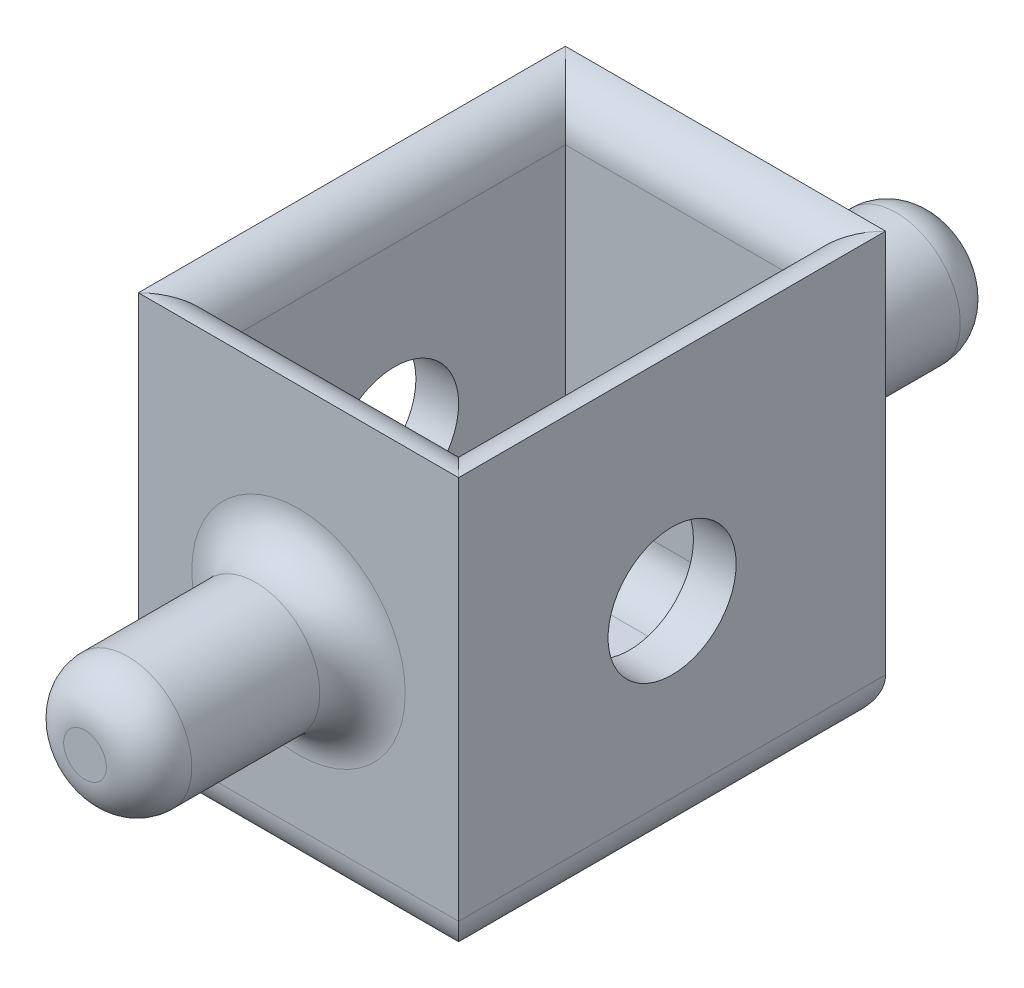
ISO-10303-21;
HEADER;
FILE_DESCRIPTION(('STEP AP214'),'2;1');
FILE_NAME('part.step','',(''),(''),'','','');
FILE_SCHEMA(('AUTOMOTIVE_DESIGN { 1 0 10303 214 1 1 1 1 }'));
ENDSEC;
DATA;
#1=APPLICATION_CONTEXT('core data for automotive mechanical design processes');
#2=APPLICATION_PROTOCOL_DEFINITION('international standard','automotive_design',2000,#1);
#3=PRODUCT_CONTEXT('',#1,'mechanical');
#4=PRODUCT('Part','Part','',(#3));
#5=PRODUCT_RELATED_PRODUCT_CATEGORY('part','',(#4));
#6=PRODUCT_DEFINITION_FORMATION('','',#4);
#7=PRODUCT_DEFINITION_CONTEXT('part definition',#1,'design');
#8=PRODUCT_DEFINITION('design','',#6,#7);
#9=PRODUCT_DEFINITION_SHAPE('','',#8);
#10=(LENGTH_UNIT() NAMED_UNIT(*) SI_UNIT(.MILLI.,.METRE.));
#11=(NAMED_UNIT(*) PLANE_ANGLE_UNIT() SI_UNIT($,.RADIAN.));
#12=(NAMED_UNIT(*) SI_UNIT($,.STERADIAN.) SOLID_ANGLE_UNIT());
#13=UNCERTAINTY_MEASURE_WITH_UNIT(LENGTH_MEASURE(1.E-05),#10,'distance_accuracy_value','');
#14=(GEOMETRIC_REPRESENTATION_CONTEXT(3) GLOBAL_UNCERTAINTY_ASSIGNED_CONTEXT((#13)) GLOBAL_UNIT_ASSIGNED_CONTEXT((#10,
#11,#12)) REPRESENTATION_CONTEXT('',''));
#15=CARTESIAN_POINT('',(0.,0.,0.));
#16=DIRECTION('',(0.,0.,1.));
#17=DIRECTION('',(1.,0.,0.));
#18=AXIS2_PLACEMENT_3D('',#15,#16,#17);
#19=CARTESIAN_POINT('',(0.,0.,0.));
#20=DIRECTION('',(0.,0.,-1.));
#21=DIRECTION('',(-1.,0.,0.));
#22=AXIS2_PLACEMENT_3D('',#19,#20,#21);
#23=PLANE('',#22);
#24=CARTESIAN_POINT('',(0.,0.,0.));
#25=DIRECTION('',(0.,0.,-1.));
#26=DIRECTION('',(-1.,0.,0.));
#27=AXIS2_PLACEMENT_3D('',#24,#25,#26);
#28=CIRCLE('',#27,6.35);
#29=CARTESIAN_POINT('',(-6.35,0.,0.));
#30=VERTEX_POINT('',#29);
#31=EDGE_CURVE('E198',#30,#30,#28,.F.);
#32=ORIENTED_EDGE('',*,*,#31,.T.);
#33=EDGE_LOOP('',(#32));
#34=FACE_BOUND('',#33,.T.);
#35=DIRECTION('',(0.,1.,0.));
#36=VECTOR('',#35,1.);
#37=CARTESIAN_POINT('',(9.525,-12.7,0.));
#38=LINE('',#37,#36);
#39=CARTESIAN_POINT('',(9.525,-10.16,0.));
#40=VERTEX_POINT('',#39);
#41=CARTESIAN_POINT('',(9.525,12.7,0.));
#42=VERTEX_POINT('',#41);
#43=EDGE_CURVE('E142',#40,#42,#38,.T.);
#44=ORIENTED_EDGE('',*,*,#43,.F.);
#45=DIRECTION('',(1.,0.,0.));
#46=VECTOR('',#45,1.);
#47=CARTESIAN_POINT('',(-9.525,-10.16,0.));
#48=LINE('',#47,#46);
#49=CARTESIAN_POINT('',(-9.525,-10.16,0.));
#50=VERTEX_POINT('',#49);
#51=EDGE_CURVE('E201',#40,#50,#48,.F.);
#52=ORIENTED_EDGE('',*,*,#51,.T.);
#53=DIRECTION('',(0.,-1.,0.));
#54=VECTOR('',#53,1.);
#55=CARTESIAN_POINT('',(-9.525,-12.7,0.));
#56=LINE('',#55,#54);
#57=CARTESIAN_POINT('',(-9.525,12.7,0.));
#58=VERTEX_POINT('',#57);
#59=EDGE_CURVE('E135',#58,#50,#56,.T.);
#60=ORIENTED_EDGE('',*,*,#59,.F.);
#61=DIRECTION('',(-1.,0.,0.));
#62=VECTOR('',#61,1.);
#63=CARTESIAN_POINT('',(-9.525,12.7,0.));
#64=LINE('',#63,#62);
#65=EDGE_CURVE('E168',#42,#58,#64,.T.);
#66=ORIENTED_EDGE('',*,*,#65,.F.);
#67=EDGE_LOOP('',(#44,#52,#60,#66));
#68=FACE_BOUND('',#67,.T.);
#69=ADVANCED_FACE('F32',(#34,#68),#23,.T.);
#70=CARTESIAN_POINT('',(0.,0.,25.4));
#71=DIRECTION('',(0.,0.,-1.));
#72=DIRECTION('',(-1.,0.,0.));
#73=AXIS2_PLACEMENT_3D('',#70,#71,#72);
#74=PLANE('',#73);
#75=CARTESIAN_POINT('',(0.,0.,25.4));
#76=DIRECTION('',(0.,0.,-1.));
#77=DIRECTION('',(-1.,0.,0.));
#78=AXIS2_PLACEMENT_3D('',#75,#76,#77);
#79=CIRCLE('',#78,6.35);
#80=CARTESIAN_POINT('',(-6.35000000000001,0.,25.4));
#81=VERTEX_POINT('',#80);
#82=EDGE_CURVE('E192',#81,#81,#79,.T.);
#83=ORIENTED_EDGE('',*,*,#82,.T.);
#84=EDGE_LOOP('',(#83));
#85=FACE_BOUND('',#84,.T.);
#86=DIRECTION('',(0.,-1.,0.));
#87=VECTOR('',#86,1.);
#88=CARTESIAN_POINT('',(-9.525,-12.7,25.4));
#89=LINE('',#88,#87);
#90=CARTESIAN_POINT('',(-9.525,12.7,25.4));
#91=VERTEX_POINT('',#90);
#92=CARTESIAN_POINT('',(-9.525,-10.16,25.4));
#93=VERTEX_POINT('',#92);
#94=EDGE_CURVE('E162',#91,#93,#89,.T.);
#95=ORIENTED_EDGE('',*,*,#94,.T.);
#96=DIRECTION('',(1.,0.,0.));
#97=VECTOR('',#96,1.);
#98=CARTESIAN_POINT('',(0.,-10.16,25.4));
#99=LINE('',#98,#97);
#100=CARTESIAN_POINT('',(9.525,-10.16,25.4));
#101=VERTEX_POINT('',#100);
#102=EDGE_CURVE('E132',#93,#101,#99,.T.);
#103=ORIENTED_EDGE('',*,*,#102,.T.);
#104=DIRECTION('',(0.,1.,0.));
#105=VECTOR('',#104,1.);
#106=CARTESIAN_POINT('',(9.525,-12.7,25.4));
#107=LINE('',#106,#105);
#108=CARTESIAN_POINT('',(9.525,12.7,25.4));
#109=VERTEX_POINT('',#108);
#110=EDGE_CURVE('E124',#101,#109,#107,.T.);
#111=ORIENTED_EDGE('',*,*,#110,.T.);
#112=DIRECTION('',(-1.,0.,0.));
#113=VECTOR('',#112,1.);
#114=CARTESIAN_POINT('',(-9.525,12.7,25.4));
#115=LINE('',#114,#113);
#116=EDGE_CURVE('E129',#109,#91,#115,.T.);
#117=ORIENTED_EDGE('',*,*,#116,.T.);
#118=EDGE_LOOP('',(#95,#103,#111,#117));
#119=FACE_BOUND('',#118,.T.);
#120=ADVANCED_FACE('F127',(#85,#119),#74,.F.);
#121=CARTESIAN_POINT('',(9.525,-12.7,25.4));
#122=DIRECTION('',(-1.,0.,0.));
#123=DIRECTION('',(0.,0.,1.));
#124=AXIS2_PLACEMENT_3D('',#121,#122,#123);
#125=PLANE('',#124);
#126=CARTESIAN_POINT('',(9.525,0.,12.7));
#127=DIRECTION('',(1.,0.,0.));
#128=DIRECTION('',(0.,0.,-1.));
#129=AXIS2_PLACEMENT_3D('',#126,#127,#128);
#130=CIRCLE('',#129,3.81);
#131=CARTESIAN_POINT('',(9.525,0.,8.89));
#132=VERTEX_POINT('',#131);
#133=EDGE_CURVE('E252',#132,#132,#130,.T.);
#134=ORIENTED_EDGE('',*,*,#133,.F.);
#135=EDGE_LOOP('',(#134));
#136=FACE_BOUND('',#135,.T.);
#137=ORIENTED_EDGE('',*,*,#110,.F.);
#138=DIRECTION('',(0.,0.,-1.));
#139=VECTOR('',#138,1.);
#140=CARTESIAN_POINT('',(9.525,-10.16,25.4));
#141=LINE('',#140,#139);
#142=EDGE_CURVE('E196',#101,#40,#141,.T.);
#143=ORIENTED_EDGE('',*,*,#142,.T.);
#144=ORIENTED_EDGE('',*,*,#43,.T.);
#145=DIRECTION('',(0.,0.,-1.));
#146=VECTOR('',#145,1.);
#147=CARTESIAN_POINT('',(9.525,12.7,25.4));
#148=LINE('',#147,#146);
#149=EDGE_CURVE('E138',#109,#42,#148,.T.);
#150=ORIENTED_EDGE('',*,*,#149,.F.);
#151=EDGE_LOOP('',(#137,#143,#144,#150));
#152=FACE_BOUND('',#151,.T.);
#153=ADVANCED_FACE('F140',(#136,#152),#125,.F.);
#154=CARTESIAN_POINT('',(-9.525,-12.7,25.4));
#155=DIRECTION('',(1.,0.,0.));
#156=DIRECTION('',(0.,0.,-1.));
#157=AXIS2_PLACEMENT_3D('',#154,#155,#156);
#158=PLANE('',#157);
#159=CARTESIAN_POINT('',(-9.525,0.,12.7));
#160=DIRECTION('',(1.,0.,0.));
#161=DIRECTION('',(0.,0.,-1.));
#162=AXIS2_PLACEMENT_3D('',#159,#160,#161);
#163=CIRCLE('',#162,3.81);
#164=CARTESIAN_POINT('',(-9.525,0.,8.89));
#165=VERTEX_POINT('',#164);
#166=EDGE_CURVE('E180',#165,#165,#163,.T.);
#167=ORIENTED_EDGE('',*,*,#166,.T.);
#168=EDGE_LOOP('',(#167));
#169=FACE_BOUND('',#168,.T.);
#170=ORIENTED_EDGE('',*,*,#59,.T.);
#171=DIRECTION('',(0.,0.,-1.));
#172=VECTOR('',#171,1.);
#173=CARTESIAN_POINT('',(-9.525,-10.16,25.4));
#174=LINE('',#173,#172);
#175=EDGE_CURVE('E189',#50,#93,#174,.F.);
#176=ORIENTED_EDGE('',*,*,#175,.T.);
#177=ORIENTED_EDGE('',*,*,#94,.F.);
#178=DIRECTION('',(0.,0.,-1.));
#179=VECTOR('',#178,1.);
#180=CARTESIAN_POINT('',(-9.525,12.7,25.4));
#181=LINE('',#180,#179);
#182=EDGE_CURVE('E148',#91,#58,#181,.T.);
#183=ORIENTED_EDGE('',*,*,#182,.T.);
#184=EDGE_LOOP('',(#170,#176,#177,#183));
#185=FACE_BOUND('',#184,.T.);
#186=ADVANCED_FACE('F290',(#169,#185),#158,.F.);
#187=CARTESIAN_POINT('',(-9.525,-12.7,25.4));
#188=DIRECTION('',(0.,1.,0.));
#189=DIRECTION('',(0.,0.,1.));
#190=AXIS2_PLACEMENT_3D('',#187,#188,#189);
#191=PLANE('',#190);
#192=DIRECTION('',(1.,0.,0.));
#193=VECTOR('',#192,1.);
#194=CARTESIAN_POINT('',(-9.525,-12.7,22.86));
#195=LINE('',#194,#193);
#196=CARTESIAN_POINT('',(6.985,-12.7,22.86));
#197=VERTEX_POINT('',#196);
#198=CARTESIAN_POINT('',(-6.985,-12.7,22.86));
#199=VERTEX_POINT('',#198);
#200=EDGE_CURVE('E184',#197,#199,#195,.F.);
#201=ORIENTED_EDGE('',*,*,#200,.T.);
#202=DIRECTION('',(0.,0.,-1.));
#203=VECTOR('',#202,1.);
#204=CARTESIAN_POINT('',(-6.985,-12.7,25.4));
#205=LINE('',#204,#203);
#206=CARTESIAN_POINT('',(-6.985,-12.7,2.54));
#207=VERTEX_POINT('',#206);
#208=EDGE_CURVE('E186',#199,#207,#205,.T.);
#209=ORIENTED_EDGE('',*,*,#208,.T.);
#210=DIRECTION('',(1.,0.,0.));
#211=VECTOR('',#210,1.);
#212=CARTESIAN_POINT('',(9.525,-12.7,2.54));
#213=LINE('',#212,#211);
#214=CARTESIAN_POINT('',(6.985,-12.7,2.54));
#215=VERTEX_POINT('',#214);
#216=EDGE_CURVE('E147',#207,#215,#213,.T.);
#217=ORIENTED_EDGE('',*,*,#216,.T.);
#218=DIRECTION('',(0.,0.,-1.));
#219=VECTOR('',#218,1.);
#220=CARTESIAN_POINT('',(6.985,-12.7,25.4));
#221=LINE('',#220,#219);
#222=EDGE_CURVE('E182',#215,#197,#221,.F.);
#223=ORIENTED_EDGE('',*,*,#222,.T.);
#224=EDGE_LOOP('',(#201,#209,#217,#223));
#225=FACE_BOUND('',#224,.T.);
#226=ADVANCED_FACE('F321',(#225),#191,.F.);
#227=CARTESIAN_POINT('',(6.985,-12.7,25.4));
#228=DIRECTION('',(-1.,0.,0.));
#229=DIRECTION('',(0.,0.,1.));
#230=AXIS2_PLACEMENT_3D('',#227,#228,#229);
#231=PLANE('',#230);
#232=CARTESIAN_POINT('',(6.985,0.,12.7));
#233=DIRECTION('',(-1.,0.,0.));
#234=DIRECTION('',(0.,0.,1.));
#235=AXIS2_PLACEMENT_3D('',#232,#233,#234);
#236=CIRCLE('',#235,3.81);
#237=CARTESIAN_POINT('',(6.985,0.,8.89));
#238=VERTEX_POINT('',#237);
#239=EDGE_CURVE('E179',#238,#238,#236,.T.);
#240=ORIENTED_EDGE('',*,*,#239,.F.);
#241=EDGE_LOOP('',(#240));
#242=FACE_BOUND('',#241,.T.);
#243=DIRECTION('',(0.,1.,0.));
#244=VECTOR('',#243,1.);
#245=CARTESIAN_POINT('',(6.985,0.,2.54));
#246=LINE('',#245,#244);
#247=CARTESIAN_POINT('',(6.985,-7.62,2.54));
#248=VERTEX_POINT('',#247);
#249=CARTESIAN_POINT('',(6.985,10.16,2.54));
#250=VERTEX_POINT('',#249);
#251=EDGE_CURVE('E280',#248,#250,#246,.T.);
#252=ORIENTED_EDGE('',*,*,#251,.F.);
#253=DIRECTION('',(0.,0.,-1.));
#254=VECTOR('',#253,1.);
#255=CARTESIAN_POINT('',(6.985,-7.62,22.86));
#256=LINE('',#255,#254);
#257=CARTESIAN_POINT('',(6.985,-7.62,22.86));
#258=VERTEX_POINT('',#257);
#259=EDGE_CURVE('E213',#248,#258,#256,.F.);
#260=ORIENTED_EDGE('',*,*,#259,.T.);
#261=DIRECTION('',(0.,1.,0.));
#262=VECTOR('',#261,1.);
#263=CARTESIAN_POINT('',(6.985,0.,22.86));
#264=LINE('',#263,#262);
#265=CARTESIAN_POINT('',(6.985,10.16,22.86));
#266=VERTEX_POINT('',#265);
#267=EDGE_CURVE('E277',#258,#266,#264,.T.);
#268=ORIENTED_EDGE('',*,*,#267,.T.);
#269=DIRECTION('',(0.,0.,-1.));
#270=VECTOR('',#269,1.);
#271=CARTESIAN_POINT('',(6.985,10.16,2.54));
#272=LINE('',#271,#270);
#273=EDGE_CURVE('E153',#266,#250,#272,.T.);
#274=ORIENTED_EDGE('',*,*,#273,.T.);
#275=EDGE_LOOP('',(#252,#260,#268,#274));
#276=FACE_BOUND('',#275,.T.);
#277=ADVANCED_FACE('F324',(#242,#276),#231,.T.);
#278=CARTESIAN_POINT('',(-6.985,-12.7,25.4));
#279=DIRECTION('',(1.,0.,0.));
#280=DIRECTION('',(0.,0.,-1.));
#281=AXIS2_PLACEMENT_3D('',#278,#279,#280);
#282=PLANE('',#281);
#283=CARTESIAN_POINT('',(-6.985,0.,12.7));
#284=DIRECTION('',(1.,0.,0.));
#285=DIRECTION('',(0.,0.,-1.));
#286=AXIS2_PLACEMENT_3D('',#283,#284,#285);
#287=CIRCLE('',#286,3.81);
#288=CARTESIAN_POINT('',(-6.985,0.,8.89));
#289=VERTEX_POINT('',#288);
#290=EDGE_CURVE('E176',#289,#289,#287,.T.);
#291=ORIENTED_EDGE('',*,*,#290,.F.);
#292=EDGE_LOOP('',(#291));
#293=FACE_BOUND('',#292,.T.);
#294=DIRECTION('',(0.,-1.,0.));
#295=VECTOR('',#294,1.);
#296=CARTESIAN_POINT('',(-6.985,0.,22.86));
#297=LINE('',#296,#295);
#298=CARTESIAN_POINT('',(-6.985,10.16,22.86));
#299=VERTEX_POINT('',#298);
#300=CARTESIAN_POINT('',(-6.985,-7.62,22.86));
#301=VERTEX_POINT('',#300);
#302=EDGE_CURVE('E169',#299,#301,#297,.T.);
#303=ORIENTED_EDGE('',*,*,#302,.T.);
#304=DIRECTION('',(0.,0.,-1.));
#305=VECTOR('',#304,1.);
#306=CARTESIAN_POINT('',(-6.985,-7.62,2.54));
#307=LINE('',#306,#305);
#308=CARTESIAN_POINT('',(-6.985,-7.62,2.54));
#309=VERTEX_POINT('',#308);
#310=EDGE_CURVE('E49',#301,#309,#307,.T.);
#311=ORIENTED_EDGE('',*,*,#310,.T.);
#312=DIRECTION('',(0.,-1.,0.));
#313=VECTOR('',#312,1.);
#314=CARTESIAN_POINT('',(-6.985,0.,2.54));
#315=LINE('',#314,#313);
#316=CARTESIAN_POINT('',(-6.985,10.16,2.54));
#317=VERTEX_POINT('',#316);
#318=EDGE_CURVE('E271',#317,#309,#315,.T.);
#319=ORIENTED_EDGE('',*,*,#318,.F.);
#320=DIRECTION('',(0.,0.,-1.));
#321=VECTOR('',#320,1.);
#322=CARTESIAN_POINT('',(-6.985,10.16,22.86));
#323=LINE('',#322,#321);
#324=EDGE_CURVE('E220',#317,#299,#323,.F.);
#325=ORIENTED_EDGE('',*,*,#324,.T.);
#326=EDGE_LOOP('',(#303,#311,#319,#325));
#327=FACE_BOUND('',#326,.T.);
#328=ADVANCED_FACE('F270',(#293,#327),#282,.T.);
#329=CARTESIAN_POINT('',(-9.525,-10.16,25.4));
#330=DIRECTION('',(0.,1.,0.));
#331=DIRECTION('',(0.,0.,1.));
#332=AXIS2_PLACEMENT_3D('',#329,#330,#331);
#333=PLANE('',#332);
#334=DIRECTION('',(1.,0.,0.));
#335=VECTOR('',#334,1.);
#336=CARTESIAN_POINT('',(6.985,-10.16,20.32));
#337=LINE('',#336,#335);
#338=CARTESIAN_POINT('',(-4.445,-10.16,20.32));
#339=VERTEX_POINT('',#338);
#340=CARTESIAN_POINT('',(4.445,-10.16,20.32));
#341=VERTEX_POINT('',#340);
#342=EDGE_CURVE('E207',#339,#341,#337,.T.);
#343=ORIENTED_EDGE('',*,*,#342,.T.);
#344=DIRECTION('',(0.,0.,-1.));
#345=VECTOR('',#344,1.);
#346=CARTESIAN_POINT('',(4.445,-10.16,2.54));
#347=LINE('',#346,#345);
#348=CARTESIAN_POINT('',(4.445,-10.16,5.08));
#349=VERTEX_POINT('',#348);
#350=EDGE_CURVE('E209',#341,#349,#347,.T.);
#351=ORIENTED_EDGE('',*,*,#350,.T.);
#352=DIRECTION('',(1.,0.,0.));
#353=VECTOR('',#352,1.);
#354=CARTESIAN_POINT('',(-9.525,-10.16,5.08));
#355=LINE('',#354,#353);
#356=CARTESIAN_POINT('',(-4.445,-10.16,5.08));
#357=VERTEX_POINT('',#356);
#358=EDGE_CURVE('E203',#349,#357,#355,.F.);
#359=ORIENTED_EDGE('',*,*,#358,.T.);
#360=DIRECTION('',(0.,0.,-1.));
#361=VECTOR('',#360,1.);
#362=CARTESIAN_POINT('',(-4.445,-10.16,22.86));
#363=LINE('',#362,#361);
#364=EDGE_CURVE('E205',#357,#339,#363,.F.);
#365=ORIENTED_EDGE('',*,*,#364,.T.);
#366=EDGE_LOOP('',(#343,#351,#359,#365));
#367=FACE_BOUND('',#366,.T.);
#368=ADVANCED_FACE('F407',(#367),#333,.T.);
#369=CARTESIAN_POINT('',(0.,0.,22.86));
#370=DIRECTION('',(0.,0.,-1.));
#371=DIRECTION('',(-1.,0.,0.));
#372=AXIS2_PLACEMENT_3D('',#369,#370,#371);
#373=PLANE('',#372);
#374=ORIENTED_EDGE('',*,*,#267,.F.);
#375=DIRECTION('',(1.,0.,0.));
#376=VECTOR('',#375,1.);
#377=CARTESIAN_POINT('',(-6.985,-7.62,22.86));
#378=LINE('',#377,#376);
#379=EDGE_CURVE('E218',#258,#301,#378,.F.);
#380=ORIENTED_EDGE('',*,*,#379,.T.);
#381=ORIENTED_EDGE('',*,*,#302,.F.);
#382=DIRECTION('',(-1.,0.,0.));
#383=VECTOR('',#382,1.);
#384=CARTESIAN_POINT('',(6.985,10.16,22.86));
#385=LINE('',#384,#383);
#386=EDGE_CURVE('E216',#299,#266,#385,.F.);
#387=ORIENTED_EDGE('',*,*,#386,.T.);
#388=EDGE_LOOP('',(#374,#380,#381,#387));
#389=FACE_BOUND('',#388,.T.);
#390=ADVANCED_FACE('F274',(#389),#373,.T.);
#391=CARTESIAN_POINT('',(0.,0.,2.54));
#392=DIRECTION('',(0.,0.,-1.));
#393=DIRECTION('',(-1.,0.,0.));
#394=AXIS2_PLACEMENT_3D('',#391,#392,#393);
#395=PLANE('',#394);
#396=ORIENTED_EDGE('',*,*,#318,.T.);
#397=DIRECTION('',(1.,0.,0.));
#398=VECTOR('',#397,1.);
#399=CARTESIAN_POINT('',(0.,-7.62,2.54));
#400=LINE('',#399,#398);
#401=EDGE_CURVE('E225',#309,#248,#400,.T.);
#402=ORIENTED_EDGE('',*,*,#401,.T.);
#403=ORIENTED_EDGE('',*,*,#251,.T.);
#404=DIRECTION('',(-1.,0.,0.));
#405=VECTOR('',#404,1.);
#406=CARTESIAN_POINT('',(0.,10.16,2.54));
#407=LINE('',#406,#405);
#408=EDGE_CURVE('E56',#250,#317,#407,.T.);
#409=ORIENTED_EDGE('',*,*,#408,.T.);
#410=EDGE_LOOP('',(#396,#402,#403,#409));
#411=FACE_BOUND('',#410,.T.);
#412=ADVANCED_FACE('F398',(#411),#395,.F.);
#413=CARTESIAN_POINT('',(0.,0.,38.1));
#414=DIRECTION('',(0.,0.,-1.));
#415=DIRECTION('',(-1.,0.,0.));
#416=AXIS2_PLACEMENT_3D('',#413,#414,#415);
#417=CYLINDRICAL_SURFACE('',#416,3.81);
#418=CARTESIAN_POINT('',(0.,0.,35.56));
#419=DIRECTION('',(0.,0.,1.));
#420=DIRECTION('',(1.,0.,0.));
#421=AXIS2_PLACEMENT_3D('',#418,#419,#420);
#422=CIRCLE('',#421,3.81);
#423=CARTESIAN_POINT('',(3.80999999999999,0.,35.56));
#424=VERTEX_POINT('',#423);
#425=EDGE_CURVE('E11',#424,#424,#422,.F.);
#426=ORIENTED_EDGE('',*,*,#425,.T.);
#427=EDGE_LOOP('',(#426));
#428=FACE_BOUND('',#427,.T.);
#429=CARTESIAN_POINT('',(0.,0.,27.94));
#430=DIRECTION('',(0.,0.,-1.));
#431=DIRECTION('',(-1.,0.,0.));
#432=AXIS2_PLACEMENT_3D('',#429,#430,#431);
#433=CIRCLE('',#432,3.81);
#434=CARTESIAN_POINT('',(-3.81000000000001,0.,27.94));
#435=VERTEX_POINT('',#434);
#436=EDGE_CURVE('E41',#435,#435,#433,.F.);
#437=ORIENTED_EDGE('',*,*,#436,.T.);
#438=EDGE_LOOP('',(#437));
#439=FACE_BOUND('',#438,.T.);
#440=ADVANCED_FACE('F390',(#428,#439),#417,.T.);
#441=CARTESIAN_POINT('',(0.,0.,38.1));
#442=DIRECTION('',(0.,0.,1.));
#443=DIRECTION('',(1.,0.,0.));
#444=AXIS2_PLACEMENT_3D('',#441,#442,#443);
#445=PLANE('',#444);
#446=CARTESIAN_POINT('',(0.,0.,38.1));
#447=DIRECTION('',(0.,0.,1.));
#448=DIRECTION('',(1.,0.,0.));
#449=AXIS2_PLACEMENT_3D('',#446,#447,#448);
#450=CIRCLE('',#449,1.27);
#451=CARTESIAN_POINT('',(1.26999999999999,0.,38.1));
#452=VERTEX_POINT('',#451);
#453=EDGE_CURVE('E236',#452,#452,#450,.T.);
#454=ORIENTED_EDGE('',*,*,#453,.T.);
#455=EDGE_LOOP('',(#454));
#456=FACE_BOUND('',#455,.T.);
#457=ADVANCED_FACE('F388',(#456),#445,.T.);
#458=CARTESIAN_POINT('',(0.,0.,-12.7));
#459=DIRECTION('',(0.,0.,1.));
#460=DIRECTION('',(1.,0.,0.));
#461=AXIS2_PLACEMENT_3D('',#458,#459,#460);
#462=CYLINDRICAL_SURFACE('',#461,3.81);
#463=CARTESIAN_POINT('',(0.,0.,-2.54));
#464=DIRECTION('',(0.,0.,-1.));
#465=DIRECTION('',(-1.,0.,0.));
#466=AXIS2_PLACEMENT_3D('',#463,#464,#465);
#467=CIRCLE('',#466,3.81);
#468=CARTESIAN_POINT('',(-3.81,0.,-2.54));
#469=VERTEX_POINT('',#468);
#470=EDGE_CURVE('E230',#469,#469,#467,.T.);
#471=ORIENTED_EDGE('',*,*,#470,.T.);
#472=EDGE_LOOP('',(#471));
#473=FACE_BOUND('',#472,.T.);
#474=CARTESIAN_POINT('',(0.,0.,-10.16));
#475=DIRECTION('',(0.,0.,-1.));
#476=DIRECTION('',(-1.,0.,0.));
#477=AXIS2_PLACEMENT_3D('',#474,#475,#476);
#478=CIRCLE('',#477,3.81);
#479=CARTESIAN_POINT('',(-3.81,0.,-10.16));
#480=VERTEX_POINT('',#479);
#481=EDGE_CURVE('E227',#480,#480,#478,.F.);
#482=ORIENTED_EDGE('',*,*,#481,.T.);
#483=EDGE_LOOP('',(#482));
#484=FACE_BOUND('',#483,.T.);
#485=ADVANCED_FACE('F306',(#473,#484),#462,.T.);
#486=CARTESIAN_POINT('',(0.,0.,-12.7));
#487=DIRECTION('',(0.,0.,-1.));
#488=DIRECTION('',(-1.,0.,0.));
#489=AXIS2_PLACEMENT_3D('',#486,#487,#488);
#490=PLANE('',#489);
#491=CARTESIAN_POINT('',(0.,0.,-12.7));
#492=DIRECTION('',(0.,0.,-1.));
#493=DIRECTION('',(-1.,0.,0.));
#494=AXIS2_PLACEMENT_3D('',#491,#492,#493);
#495=CIRCLE('',#494,1.27);
#496=CARTESIAN_POINT('',(-1.27,0.,-12.7));
#497=VERTEX_POINT('',#496);
#498=EDGE_CURVE('E233',#497,#497,#495,.T.);
#499=ORIENTED_EDGE('',*,*,#498,.T.);
#500=EDGE_LOOP('',(#499));
#501=FACE_BOUND('',#500,.T.);
#502=ADVANCED_FACE('F296',(#501),#490,.T.);
#503=CARTESIAN_POINT('',(-9.525,0.,12.7));
#504=DIRECTION('',(1.,0.,0.));
#505=DIRECTION('',(0.,0.,-1.));
#506=AXIS2_PLACEMENT_3D('',#503,#504,#505);
#507=CYLINDRICAL_SURFACE('',#506,3.81);
#508=CARTESIAN_POINT('',(-6.985,0.,8.89));
#509=CARTESIAN_POINT('',(-7.01145833333333,0.,8.89));
#510=CARTESIAN_POINT('',(-7.03791666666667,0.,8.89));
#511=CARTESIAN_POINT('',(-7.09083333333334,0.,8.89));
#512=CARTESIAN_POINT('',(-7.11729166666667,0.,8.89));
#513=CARTESIAN_POINT('',(-7.17020833333334,0.,8.89));
#514=CARTESIAN_POINT('',(-7.19666666666667,0.,8.89));
#515=CARTESIAN_POINT('',(-7.24958333333334,0.,8.89));
#516=CARTESIAN_POINT('',(-7.27604166666667,0.,8.89));
#517=CARTESIAN_POINT('',(-7.32895833333334,0.,8.89));
#518=CARTESIAN_POINT('',(-7.35541666666667,0.,8.89));
#519=CARTESIAN_POINT('',(-7.40833333333333,0.,8.89));
#520=CARTESIAN_POINT('',(-7.43479166666667,0.,8.89));
#521=CARTESIAN_POINT('',(-7.48770833333334,0.,8.89));
#522=CARTESIAN_POINT('',(-7.51416666666667,0.,8.89));
#523=CARTESIAN_POINT('',(-7.56708333333334,0.,8.89));
#524=CARTESIAN_POINT('',(-7.59354166666667,0.,8.89));
#525=CARTESIAN_POINT('',(-7.64645833333334,0.,8.89));
#526=CARTESIAN_POINT('',(-7.67291666666667,0.,8.89));
#527=CARTESIAN_POINT('',(-7.72583333333334,0.,8.89));
#528=CARTESIAN_POINT('',(-7.75229166666667,0.,8.89));
#529=CARTESIAN_POINT('',(-7.80520833333334,0.,8.89));
#530=CARTESIAN_POINT('',(-7.83166666666667,0.,8.89));
#531=CARTESIAN_POINT('',(-7.88458333333334,0.,8.89));
#532=CARTESIAN_POINT('',(-7.91104166666667,0.,8.89));
#533=CARTESIAN_POINT('',(-7.96395833333334,0.,8.89));
#534=CARTESIAN_POINT('',(-7.99041666666667,0.,8.89));
#535=CARTESIAN_POINT('',(-8.04333333333334,0.,8.89));
#536=CARTESIAN_POINT('',(-8.06979166666667,0.,8.89));
#537=CARTESIAN_POINT('',(-8.12270833333334,0.,8.89));
#538=CARTESIAN_POINT('',(-8.14916666666667,0.,8.89));
#539=CARTESIAN_POINT('',(-8.20208333333334,0.,8.89));
#540=CARTESIAN_POINT('',(-8.22854166666667,0.,8.89));
#541=CARTESIAN_POINT('',(-8.28145833333333,0.,8.89));
#542=CARTESIAN_POINT('',(-8.30791666666667,0.,8.89));
#543=CARTESIAN_POINT('',(-8.36083333333334,0.,8.89));
#544=CARTESIAN_POINT('',(-8.38729166666667,0.,8.89));
#545=CARTESIAN_POINT('',(-8.44020833333334,0.,8.89));
#546=CARTESIAN_POINT('',(-8.46666666666667,0.,8.89));
#547=CARTESIAN_POINT('',(-8.51958333333334,0.,8.89));
#548=CARTESIAN_POINT('',(-8.54604166666667,0.,8.89));
#549=CARTESIAN_POINT('',(-8.59895833333334,0.,8.89));
#550=CARTESIAN_POINT('',(-8.62541666666667,0.,8.89));
#551=CARTESIAN_POINT('',(-8.67833333333334,0.,8.89));
#552=CARTESIAN_POINT('',(-8.70479166666667,0.,8.89));
#553=CARTESIAN_POINT('',(-8.75770833333334,0.,8.89));
#554=CARTESIAN_POINT('',(-8.78416666666667,0.,8.89));
#555=CARTESIAN_POINT('',(-8.83708333333334,0.,8.89));
#556=CARTESIAN_POINT('',(-8.86354166666667,0.,8.89));
#557=CARTESIAN_POINT('',(-8.91645833333333,0.,8.89));
#558=CARTESIAN_POINT('',(-8.94291666666667,0.,8.89));
#559=CARTESIAN_POINT('',(-8.99583333333334,0.,8.89));
#560=CARTESIAN_POINT('',(-9.02229166666667,0.,8.89));
#561=CARTESIAN_POINT('',(-9.07520833333334,0.,8.89));
#562=CARTESIAN_POINT('',(-9.10166666666667,0.,8.89));
#563=CARTESIAN_POINT('',(-9.15458333333334,0.,8.89));
#564=CARTESIAN_POINT('',(-9.18104166666667,0.,8.89));
#565=CARTESIAN_POINT('',(-9.23395833333334,0.,8.89));
#566=CARTESIAN_POINT('',(-9.26041666666667,0.,8.89));
#567=CARTESIAN_POINT('',(-9.31333333333334,0.,8.89));
#568=CARTESIAN_POINT('',(-9.33979166666667,0.,8.89));
#569=CARTESIAN_POINT('',(-9.39270833333334,0.,8.89));
#570=CARTESIAN_POINT('',(-9.41916666666667,0.,8.89));
#571=CARTESIAN_POINT('',(-9.47208333333334,0.,8.89));
#572=CARTESIAN_POINT('',(-9.49854166666667,0.,8.89));
#573=CARTESIAN_POINT('',(-9.525,0.,8.89));
#574=B_SPLINE_CURVE_WITH_KNOTS('',3,(#508,#509,#510,#511,#512,#513,#514,#515,#516,#517,#518,
#519,#520,#521,#522,#523,#524,#525,#526,#527,#528,#529,#530,#531,#532,#533,#534,#535,#536,#537,
#538,#539,#540,#541,#542,#543,#544,#545,#546,#547,#548,#549,#550,#551,#552,#553,#554,#555,#556,
#557,#558,#559,#560,#561,#562,#563,#564,#565,#566,#567,#568,#569,#570,#571,#572,#573),
.UNSPECIFIED.,.F.,.F.,(4,2,2,2,2,2,2,2,2,2,2,2,2,2,2,2,2,2,2,2,2,2,2,2,2,2,2,2,2,2,2,2,4),(0.,
0.0793750000000004,0.158750000000001,0.238125,0.3175,0.396875000000001,0.476250000000001,
0.555625000000001,0.635,0.714375000000001,0.793750000000001,0.873125000000001,0.9525,1.031875,
1.11125,1.190625,1.27,1.349375,1.42875,1.508125,1.5875,1.666875,1.74625,1.825625,1.905,1.984375,
2.06375,2.143125,2.2225,2.301875,2.38125,2.460625,2.54),.UNSPECIFIED.);
#575=EDGE_CURVE('BSEAM293',#289,#165,#574,.T.);
#576=ORIENTED_EDGE('',*,*,#290,.T.);
#577=ORIENTED_EDGE('',*,*,#166,.F.);
#578=ORIENTED_EDGE('',*,*,#575,.T.);
#579=ORIENTED_EDGE('',*,*,#575,.F.);
#580=EDGE_LOOP('',(#576,#578,#577,#579));
#581=FACE_BOUND('',#580,.T.);
#582=ADVANCED_FACE('F293',(#581),#507,.F.);
#583=CARTESIAN_POINT('',(6.985,0.,8.89));
#584=CARTESIAN_POINT('',(7.01145833333333,0.,8.89));
#585=CARTESIAN_POINT('',(7.03791666666666,0.,8.89));
#586=CARTESIAN_POINT('',(7.09083333333333,0.,8.89));
#587=CARTESIAN_POINT('',(7.11729166666666,0.,8.89));
#588=CARTESIAN_POINT('',(7.17020833333333,0.,8.89));
#589=CARTESIAN_POINT('',(7.19666666666666,0.,8.89));
#590=CARTESIAN_POINT('',(7.24958333333333,0.,8.89));
#591=CARTESIAN_POINT('',(7.27604166666666,0.,8.89));
#592=CARTESIAN_POINT('',(7.32895833333333,0.,8.89));
#593=CARTESIAN_POINT('',(7.35541666666667,0.,8.89));
#594=CARTESIAN_POINT('',(7.40833333333333,0.,8.89));
#595=CARTESIAN_POINT('',(7.43479166666667,0.,8.89));
#596=CARTESIAN_POINT('',(7.48770833333333,0.,8.89));
#597=CARTESIAN_POINT('',(7.51416666666667,0.,8.89));
#598=CARTESIAN_POINT('',(7.56708333333333,0.,8.89));
#599=CARTESIAN_POINT('',(7.59354166666667,0.,8.89));
#600=CARTESIAN_POINT('',(7.64645833333333,0.,8.89));
#601=CARTESIAN_POINT('',(7.67291666666666,0.,8.89));
#602=CARTESIAN_POINT('',(7.72583333333333,0.,8.89));
#603=CARTESIAN_POINT('',(7.75229166666666,0.,8.89));
#604=CARTESIAN_POINT('',(7.80520833333333,0.,8.89));
#605=CARTESIAN_POINT('',(7.83166666666666,0.,8.89));
#606=CARTESIAN_POINT('',(7.88458333333333,0.,8.89));
#607=CARTESIAN_POINT('',(7.91104166666666,0.,8.89));
#608=CARTESIAN_POINT('',(7.96395833333333,0.,8.89));
#609=CARTESIAN_POINT('',(7.99041666666667,0.,8.89));
#610=CARTESIAN_POINT('',(8.04333333333333,0.,8.89));
#611=CARTESIAN_POINT('',(8.06979166666667,0.,8.89));
#612=CARTESIAN_POINT('',(8.12270833333333,0.,8.89));
#613=CARTESIAN_POINT('',(8.14916666666667,0.,8.89));
#614=CARTESIAN_POINT('',(8.20208333333333,0.,8.89));
#615=CARTESIAN_POINT('',(8.22854166666666,0.,8.89));
#616=CARTESIAN_POINT('',(8.28145833333333,0.,8.89));
#617=CARTESIAN_POINT('',(8.30791666666667,0.,8.89));
#618=CARTESIAN_POINT('',(8.36083333333333,0.,8.89));
#619=CARTESIAN_POINT('',(8.38729166666666,0.,8.89));
#620=CARTESIAN_POINT('',(8.44020833333333,0.,8.89));
#621=CARTESIAN_POINT('',(8.46666666666666,0.,8.89));
#622=CARTESIAN_POINT('',(8.51958333333333,0.,8.89));
#623=CARTESIAN_POINT('',(8.54604166666666,0.,8.89));
#624=CARTESIAN_POINT('',(8.59895833333333,0.,8.89));
#625=CARTESIAN_POINT('',(8.62541666666666,0.,8.89));
#626=CARTESIAN_POINT('',(8.67833333333333,0.,8.89));
#627=CARTESIAN_POINT('',(8.70479166666667,0.,8.89));
#628=CARTESIAN_POINT('',(8.75770833333333,0.,8.89));
#629=CARTESIAN_POINT('',(8.78416666666667,0.,8.89));
#630=CARTESIAN_POINT('',(8.83708333333333,0.,8.89));
#631=CARTESIAN_POINT('',(8.86354166666666,0.,8.89));
#632=CARTESIAN_POINT('',(8.91645833333333,0.,8.89));
#633=CARTESIAN_POINT('',(8.94291666666667,0.,8.89));
#634=CARTESIAN_POINT('',(8.99583333333333,0.,8.89));
#635=CARTESIAN_POINT('',(9.02229166666666,0.,8.89));
#636=CARTESIAN_POINT('',(9.07520833333333,0.,8.89));
#637=CARTESIAN_POINT('',(9.10166666666666,0.,8.89));
#638=CARTESIAN_POINT('',(9.15458333333333,0.,8.89));
#639=CARTESIAN_POINT('',(9.18104166666667,0.,8.89));
#640=CARTESIAN_POINT('',(9.23395833333333,0.,8.89));
#641=CARTESIAN_POINT('',(9.26041666666667,0.,8.89));
#642=CARTESIAN_POINT('',(9.31333333333333,0.,8.89));
#643=CARTESIAN_POINT('',(9.33979166666667,0.,8.89));
#644=CARTESIAN_POINT('',(9.39270833333333,0.,8.89));
#645=CARTESIAN_POINT('',(9.41916666666667,0.,8.89));
#646=CARTESIAN_POINT('',(9.47208333333333,0.,8.89));
#647=CARTESIAN_POINT('',(9.49854166666667,0.,8.89));
#648=CARTESIAN_POINT('',(9.525,0.,8.89));
#649=B_SPLINE_CURVE_WITH_KNOTS('',3,(#583,#584,#585,#586,#587,#588,#589,#590,#591,#592,#593,
#594,#595,#596,#597,#598,#599,#600,#601,#602,#603,#604,#605,#606,#607,#608,#609,#610,#611,#612,
#613,#614,#615,#616,#617,#618,#619,#620,#621,#622,#623,#624,#625,#626,#627,#628,#629,#630,#631,
#632,#633,#634,#635,#636,#637,#638,#639,#640,#641,#642,#643,#644,#645,#646,#647,#648),
.UNSPECIFIED.,.F.,.F.,(4,2,2,2,2,2,2,2,2,2,2,2,2,2,2,2,2,2,2,2,2,2,2,2,2,2,2,2,2,2,2,2,4),(0.,
0.0793749999999996,0.158749999999999,0.238124999999999,0.317499999999998,0.396875000000001,
0.476250000000001,0.555625000000001,0.635,0.714375,0.793749999999999,0.873124999999999,
0.952500000000002,1.031875,1.11125,1.190625,1.27,1.349375,1.42875,1.508125,1.5875,1.666875,
1.74625,1.825625,1.905,1.984375,2.06375,2.143125,2.2225,2.301875,2.38125,2.460625,2.54),.UNSPECIFIED.);
#650=EDGE_CURVE('BSEAM295',#238,#132,#649,.T.);
#651=ORIENTED_EDGE('',*,*,#239,.T.);
#652=ORIENTED_EDGE('',*,*,#133,.T.);
#653=ORIENTED_EDGE('',*,*,#650,.T.);
#654=ORIENTED_EDGE('',*,*,#650,.F.);
#655=EDGE_LOOP('',(#651,#653,#652,#654));
#656=FACE_BOUND('',#655,.T.);
#657=ADVANCED_FACE('F295',(#656),#507,.F.);
#658=CARTESIAN_POINT('',(6.985,-10.16,25.4));
#659=DIRECTION('',(0.,0.,-1.));
#660=DIRECTION('',(-1.,0.,0.));
#661=AXIS2_PLACEMENT_3D('',#658,#659,#660);
#662=CYLINDRICAL_SURFACE('',#661,2.54);
#663=CARTESIAN_POINT('',(6.985,-10.16,2.54));
#664=DIRECTION('',(-0.707106781186547,0.,-0.707106781186547));
#665=DIRECTION('',(-0.707106781186547,0.,0.707106781186547));
#666=AXIS2_PLACEMENT_3D('',#663,#664,#665);
#667=ELLIPSE('',#666,3.59210244842766,2.54);
#668=EDGE_CURVE('E246',#40,#215,#667,.T.);
#669=ORIENTED_EDGE('',*,*,#668,.F.);
#670=ORIENTED_EDGE('',*,*,#142,.F.);
#671=CARTESIAN_POINT('',(6.985,-10.16,22.86));
#672=DIRECTION('',(0.707106781186547,0.,-0.707106781186547));
#673=DIRECTION('',(-0.707106781186547,0.,-0.707106781186547));
#674=AXIS2_PLACEMENT_3D('',#671,#672,#673);
#675=ELLIPSE('',#674,3.59210244842766,2.54);
#676=EDGE_CURVE('E249',#197,#101,#675,.F.);
#677=ORIENTED_EDGE('',*,*,#676,.F.);
#678=ORIENTED_EDGE('',*,*,#222,.F.);
#679=EDGE_LOOP('',(#669,#670,#677,#678));
#680=FACE_BOUND('',#679,.T.);
#681=ADVANCED_FACE('F303',(#680),#662,.T.);
#682=CARTESIAN_POINT('',(0.,-10.16,22.86));
#683=DIRECTION('',(1.,0.,0.));
#684=DIRECTION('',(0.,0.,-1.));
#685=AXIS2_PLACEMENT_3D('',#682,#683,#684);
#686=CYLINDRICAL_SURFACE('',#685,2.54);
#687=ORIENTED_EDGE('',*,*,#676,.T.);
#688=ORIENTED_EDGE('',*,*,#102,.F.);
#689=CARTESIAN_POINT('',(-6.985,-10.16,22.86));
#690=DIRECTION('',(0.707106781186547,0.,0.707106781186547));
#691=DIRECTION('',(0.707106781186547,0.,-0.707106781186547));
#692=AXIS2_PLACEMENT_3D('',#689,#690,#691);
#693=ELLIPSE('',#692,3.59210244842766,2.54);
#694=EDGE_CURVE('E243',#199,#93,#693,.F.);
#695=ORIENTED_EDGE('',*,*,#694,.F.);
#696=ORIENTED_EDGE('',*,*,#200,.F.);
#697=EDGE_LOOP('',(#687,#688,#695,#696));
#698=FACE_BOUND('',#697,.T.);
#699=ADVANCED_FACE('F339',(#698),#686,.T.);
#700=CARTESIAN_POINT('',(-9.525,-10.16,2.54));
#701=DIRECTION('',(-1.,0.,0.));
#702=DIRECTION('',(0.,0.,1.));
#703=AXIS2_PLACEMENT_3D('',#700,#701,#702);
#704=CYLINDRICAL_SURFACE('',#703,2.54);
#705=ORIENTED_EDGE('',*,*,#668,.T.);
#706=ORIENTED_EDGE('',*,*,#216,.F.);
#707=CARTESIAN_POINT('',(-6.985,-10.16,2.54));
#708=DIRECTION('',(-0.707106781186547,0.,0.707106781186547));
#709=DIRECTION('',(-0.707106781186547,0.,-0.707106781186547));
#710=AXIS2_PLACEMENT_3D('',#707,#708,#709);
#711=ELLIPSE('',#710,3.59210244842766,2.54);
#712=EDGE_CURVE('E241',#50,#207,#711,.T.);
#713=ORIENTED_EDGE('',*,*,#712,.F.);
#714=ORIENTED_EDGE('',*,*,#51,.F.);
#715=EDGE_LOOP('',(#705,#706,#713,#714));
#716=FACE_BOUND('',#715,.T.);
#717=ADVANCED_FACE('F335',(#716),#704,.T.);
#718=CARTESIAN_POINT('',(-6.985,-10.16,25.4));
#719=DIRECTION('',(0.,0.,-1.));
#720=DIRECTION('',(-1.,0.,0.));
#721=AXIS2_PLACEMENT_3D('',#718,#719,#720);
#722=CYLINDRICAL_SURFACE('',#721,2.54);
#723=ORIENTED_EDGE('',*,*,#694,.T.);
#724=ORIENTED_EDGE('',*,*,#175,.F.);
#725=ORIENTED_EDGE('',*,*,#712,.T.);
#726=ORIENTED_EDGE('',*,*,#208,.F.);
#727=EDGE_LOOP('',(#723,#724,#725,#726));
#728=FACE_BOUND('',#727,.T.);
#729=ADVANCED_FACE('F331',(#728),#722,.T.);
#730=CARTESIAN_POINT('',(-4.445,-7.62,25.4));
#731=DIRECTION('',(0.,0.,1.));
#732=DIRECTION('',(1.,0.,0.));
#733=AXIS2_PLACEMENT_3D('',#730,#731,#732);
#734=CYLINDRICAL_SURFACE('',#733,2.54);
#735=CARTESIAN_POINT('',(-4.445,-7.62,5.08));
#736=DIRECTION('',(-0.707106781186547,0.,0.707106781186547));
#737=DIRECTION('',(0.707106781186547,0.,0.707106781186547));
#738=AXIS2_PLACEMENT_3D('',#735,#736,#737);
#739=ELLIPSE('',#738,3.59210244842766,2.54);
#740=EDGE_CURVE('E256',#309,#357,#739,.T.);
#741=ORIENTED_EDGE('',*,*,#740,.F.);
#742=ORIENTED_EDGE('',*,*,#310,.F.);
#743=CARTESIAN_POINT('',(-4.445,-7.62,20.32));
#744=DIRECTION('',(-0.707106781186547,0.,-0.707106781186547));
#745=DIRECTION('',(-0.707106781186547,0.,0.707106781186547));
#746=AXIS2_PLACEMENT_3D('',#743,#744,#745);
#747=ELLIPSE('',#746,3.59210244842766,2.54);
#748=EDGE_CURVE('E244',#339,#301,#747,.T.);
#749=ORIENTED_EDGE('',*,*,#748,.F.);
#750=ORIENTED_EDGE('',*,*,#364,.F.);
#751=EDGE_LOOP('',(#741,#742,#749,#750));
#752=FACE_BOUND('',#751,.T.);
#753=ADVANCED_FACE('F334',(#752),#734,.F.);
#754=CARTESIAN_POINT('',(-9.525,-7.62,20.32));
#755=DIRECTION('',(-1.,0.,0.));
#756=DIRECTION('',(0.,0.,1.));
#757=AXIS2_PLACEMENT_3D('',#754,#755,#756);
#758=CYLINDRICAL_SURFACE('',#757,2.54);
#759=ORIENTED_EDGE('',*,*,#748,.T.);
#760=ORIENTED_EDGE('',*,*,#379,.F.);
#761=CARTESIAN_POINT('',(4.445,-7.62,20.32));
#762=DIRECTION('',(-0.707106781186547,0.,0.707106781186547));
#763=DIRECTION('',(0.707106781186547,0.,0.707106781186547));
#764=AXIS2_PLACEMENT_3D('',#761,#762,#763);
#765=ELLIPSE('',#764,3.59210244842766,2.54);
#766=EDGE_CURVE('E254',#341,#258,#765,.T.);
#767=ORIENTED_EDGE('',*,*,#766,.F.);
#768=ORIENTED_EDGE('',*,*,#342,.F.);
#769=EDGE_LOOP('',(#759,#760,#767,#768));
#770=FACE_BOUND('',#769,.T.);
#771=ADVANCED_FACE('F355',(#770),#758,.F.);
#772=CARTESIAN_POINT('',(0.,-7.62,5.08));
#773=DIRECTION('',(1.,0.,0.));
#774=DIRECTION('',(0.,0.,-1.));
#775=AXIS2_PLACEMENT_3D('',#772,#773,#774);
#776=CYLINDRICAL_SURFACE('',#775,2.54);
#777=ORIENTED_EDGE('',*,*,#740,.T.);
#778=ORIENTED_EDGE('',*,*,#358,.F.);
#779=CARTESIAN_POINT('',(4.445,-7.62,5.08));
#780=DIRECTION('',(0.707106781186547,0.,0.707106781186547));
#781=DIRECTION('',(-0.707106781186547,0.,0.707106781186547));
#782=AXIS2_PLACEMENT_3D('',#779,#780,#781);
#783=ELLIPSE('',#782,3.59210244842766,2.54);
#784=EDGE_CURVE('E156',#248,#349,#783,.F.);
#785=ORIENTED_EDGE('',*,*,#784,.F.);
#786=ORIENTED_EDGE('',*,*,#401,.F.);
#787=EDGE_LOOP('',(#777,#778,#785,#786));
#788=FACE_BOUND('',#787,.T.);
#789=ADVANCED_FACE('F351',(#788),#776,.F.);
#790=CARTESIAN_POINT('',(4.445,-7.62,25.4));
#791=DIRECTION('',(0.,0.,1.));
#792=DIRECTION('',(1.,0.,0.));
#793=AXIS2_PLACEMENT_3D('',#790,#791,#792);
#794=CYLINDRICAL_SURFACE('',#793,2.54);
#795=ORIENTED_EDGE('',*,*,#766,.T.);
#796=ORIENTED_EDGE('',*,*,#259,.F.);
#797=ORIENTED_EDGE('',*,*,#784,.T.);
#798=ORIENTED_EDGE('',*,*,#350,.F.);
#799=EDGE_LOOP('',(#795,#796,#797,#798));
#800=FACE_BOUND('',#799,.T.);
#801=ADVANCED_FACE('F347',(#800),#794,.F.);
#802=CARTESIAN_POINT('',(0.,0.,-2.54));
#803=DIRECTION('',(0.,0.,-1.));
#804=DIRECTION('',(-1.,0.,0.));
#805=AXIS2_PLACEMENT_3D('',#802,#803,#804);
#806=TOROIDAL_SURFACE('',#805,6.35,2.54);
#807=ORIENTED_EDGE('',*,*,#31,.F.);
#808=EDGE_LOOP('',(#807));
#809=FACE_BOUND('',#808,.T.);
#810=ORIENTED_EDGE('',*,*,#470,.F.);
#811=EDGE_LOOP('',(#810));
#812=FACE_BOUND('',#811,.T.);
#813=ADVANCED_FACE('F350',(#809,#812),#806,.F.);
#814=CARTESIAN_POINT('',(0.,0.,-10.16));
#815=DIRECTION('',(0.,0.,-1.));
#816=DIRECTION('',(-1.,0.,0.));
#817=AXIS2_PLACEMENT_3D('',#814,#815,#816);
#818=DEGENERATE_TOROIDAL_SURFACE('',#817,1.27,2.54,.T.);
#819=ORIENTED_EDGE('',*,*,#481,.F.);
#820=EDGE_LOOP('',(#819));
#821=FACE_BOUND('',#820,.T.);
#822=ORIENTED_EDGE('',*,*,#498,.F.);
#823=EDGE_LOOP('',(#822));
#824=FACE_BOUND('',#823,.T.);
#825=ADVANCED_FACE('F365',(#821,#824),#818,.T.);
#826=CARTESIAN_POINT('',(9.525,10.16,25.4));
#827=DIRECTION('',(0.,0.,1.));
#828=DIRECTION('',(1.,0.,0.));
#829=AXIS2_PLACEMENT_3D('',#826,#827,#828);
#830=CYLINDRICAL_SURFACE('',#829,2.54);
#831=CARTESIAN_POINT('',(9.525,10.16,0.));
#832=DIRECTION('',(-0.707106781186547,0.,-0.707106781186547));
#833=DIRECTION('',(-0.707106781186547,0.,0.707106781186547));
#834=AXIS2_PLACEMENT_3D('',#831,#832,#833);
#835=ELLIPSE('',#834,3.59210244842766,2.54);
#836=EDGE_CURVE('E157',#250,#42,#835,.T.);
#837=ORIENTED_EDGE('',*,*,#836,.F.);
#838=ORIENTED_EDGE('',*,*,#273,.F.);
#839=CARTESIAN_POINT('',(9.525,10.16,25.4));
#840=DIRECTION('',(-0.707106781186547,0.,0.707106781186547));
#841=DIRECTION('',(0.707106781186547,0.,0.707106781186547));
#842=AXIS2_PLACEMENT_3D('',#839,#840,#841);
#843=ELLIPSE('',#842,3.59210244842766,2.54);
#844=EDGE_CURVE('E36',#109,#266,#843,.T.);
#845=ORIENTED_EDGE('',*,*,#844,.F.);
#846=ORIENTED_EDGE('',*,*,#149,.T.);
#847=EDGE_LOOP('',(#837,#838,#845,#846));
#848=FACE_BOUND('',#847,.T.);
#849=ADVANCED_FACE('F152',(#848),#830,.T.);
#850=CARTESIAN_POINT('',(-9.525,10.16,25.4));
#851=DIRECTION('',(1.,0.,0.));
#852=DIRECTION('',(0.,0.,-1.));
#853=AXIS2_PLACEMENT_3D('',#850,#851,#852);
#854=CYLINDRICAL_SURFACE('',#853,2.54);
#855=ORIENTED_EDGE('',*,*,#844,.T.);
#856=ORIENTED_EDGE('',*,*,#386,.F.);
#857=CARTESIAN_POINT('',(-9.525,10.16,25.4));
#858=DIRECTION('',(0.707106781186547,0.,0.707106781186547));
#859=DIRECTION('',(-0.707106781186547,0.,0.707106781186547));
#860=AXIS2_PLACEMENT_3D('',#857,#858,#859);
#861=ELLIPSE('',#860,3.59210244842766,2.54);
#862=EDGE_CURVE('E160',#91,#299,#861,.F.);
#863=ORIENTED_EDGE('',*,*,#862,.F.);
#864=ORIENTED_EDGE('',*,*,#116,.F.);
#865=EDGE_LOOP('',(#855,#856,#863,#864));
#866=FACE_BOUND('',#865,.T.);
#867=ADVANCED_FACE('F159',(#866),#854,.T.);
#868=CARTESIAN_POINT('',(0.,10.16,0.));
#869=DIRECTION('',(-1.,0.,0.));
#870=DIRECTION('',(0.,0.,1.));
#871=AXIS2_PLACEMENT_3D('',#868,#869,#870);
#872=CYLINDRICAL_SURFACE('',#871,2.54);
#873=ORIENTED_EDGE('',*,*,#836,.T.);
#874=ORIENTED_EDGE('',*,*,#65,.T.);
#875=CARTESIAN_POINT('',(-9.525,10.16,0.));
#876=DIRECTION('',(-0.707106781186547,0.,0.707106781186547));
#877=DIRECTION('',(0.707106781186547,0.,0.707106781186547));
#878=AXIS2_PLACEMENT_3D('',#875,#876,#877);
#879=ELLIPSE('',#878,3.59210244842766,2.54);
#880=EDGE_CURVE('E261',#317,#58,#879,.T.);
#881=ORIENTED_EDGE('',*,*,#880,.F.);
#882=ORIENTED_EDGE('',*,*,#408,.F.);
#883=EDGE_LOOP('',(#873,#874,#881,#882));
#884=FACE_BOUND('',#883,.T.);
#885=ADVANCED_FACE('F264',(#884),#872,.T.);
#886=CARTESIAN_POINT('',(-9.525,10.16,25.4));
#887=DIRECTION('',(0.,0.,1.));
#888=DIRECTION('',(1.,0.,0.));
#889=AXIS2_PLACEMENT_3D('',#886,#887,#888);
#890=CYLINDRICAL_SURFACE('',#889,2.54);
#891=ORIENTED_EDGE('',*,*,#862,.T.);
#892=ORIENTED_EDGE('',*,*,#324,.F.);
#893=ORIENTED_EDGE('',*,*,#880,.T.);
#894=ORIENTED_EDGE('',*,*,#182,.F.);
#895=EDGE_LOOP('',(#891,#892,#893,#894));
#896=FACE_BOUND('',#895,.T.);
#897=ADVANCED_FACE('F268',(#896),#890,.T.);
#898=CARTESIAN_POINT('',(0.,0.,35.56));
#899=DIRECTION('',(0.,0.,1.));
#900=DIRECTION('',(1.,0.,0.));
#901=AXIS2_PLACEMENT_3D('',#898,#899,#900);
#902=DEGENERATE_TOROIDAL_SURFACE('',#901,1.27,2.54,.T.);
#903=ORIENTED_EDGE('',*,*,#425,.F.);
#904=EDGE_LOOP('',(#903));
#905=FACE_BOUND('',#904,.T.);
#906=ORIENTED_EDGE('',*,*,#453,.F.);
#907=EDGE_LOOP('',(#906));
#908=FACE_BOUND('',#907,.T.);
#909=ADVANCED_FACE('F372',(#905,#908),#902,.T.);
#910=CARTESIAN_POINT('',(0.,0.,27.94));
#911=DIRECTION('',(0.,0.,-1.));
#912=DIRECTION('',(-1.,0.,0.));
#913=AXIS2_PLACEMENT_3D('',#910,#911,#912);
#914=TOROIDAL_SURFACE('',#913,6.35,2.54);
#915=ORIENTED_EDGE('',*,*,#82,.F.);
#916=EDGE_LOOP('',(#915));
#917=FACE_BOUND('',#916,.T.);
#918=ORIENTED_EDGE('',*,*,#436,.F.);
#919=EDGE_LOOP('',(#918));
#920=FACE_BOUND('',#919,.T.);
#921=ADVANCED_FACE('F34',(#917,#920),#914,.F.);
#922=CLOSED_SHELL('',(#69,#120,#153,#186,#226,#277,#328,#368,#390,#412,#440,#457,#485,#502,#582,
#657,#681,#699,#717,#729,#753,#771,#789,#801,#813,#825,#849,#867,#885,#897,#909,#921));
#923=MANIFOLD_SOLID_BREP('B2',#922);
#924=ADVANCED_BREP_SHAPE_REPRESENTATION('',(#18,#923),#14);
#925=SHAPE_DEFINITION_REPRESENTATION(#9,#924);
ENDSEC;
END-ISO-10303-21;
